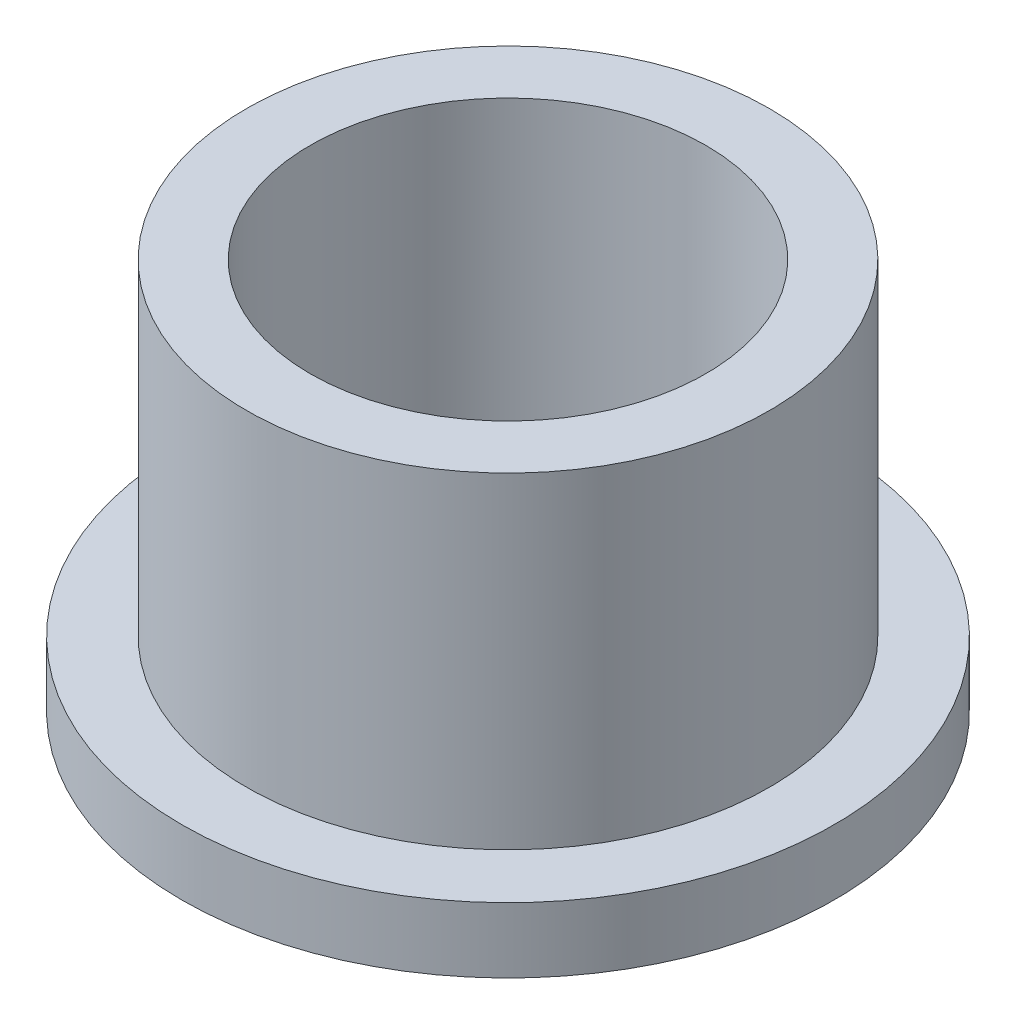
ISO-10303-21;
HEADER;
FILE_DESCRIPTION(('STEP AP214'),'2;1');
FILE_NAME('part.step','',(''),(''),'','','');
FILE_SCHEMA(('AUTOMOTIVE_DESIGN { 1 0 10303 214 1 1 1 1 }'));
ENDSEC;
DATA;
#1=APPLICATION_CONTEXT('core data for automotive mechanical design processes');
#2=APPLICATION_PROTOCOL_DEFINITION('international standard','automotive_design',2000,#1);
#3=PRODUCT_CONTEXT('',#1,'mechanical');
#4=PRODUCT('Part','Part','',(#3));
#5=PRODUCT_RELATED_PRODUCT_CATEGORY('part','',(#4));
#6=PRODUCT_DEFINITION_FORMATION('','',#4);
#7=PRODUCT_DEFINITION_CONTEXT('part definition',#1,'design');
#8=PRODUCT_DEFINITION('design','',#6,#7);
#9=PRODUCT_DEFINITION_SHAPE('','',#8);
#10=(LENGTH_UNIT() NAMED_UNIT(*) SI_UNIT(.MILLI.,.METRE.));
#11=(NAMED_UNIT(*) PLANE_ANGLE_UNIT() SI_UNIT($,.RADIAN.));
#12=(NAMED_UNIT(*) SI_UNIT($,.STERADIAN.) SOLID_ANGLE_UNIT());
#13=UNCERTAINTY_MEASURE_WITH_UNIT(LENGTH_MEASURE(1.E-05),#10,'distance_accuracy_value','');
#14=(GEOMETRIC_REPRESENTATION_CONTEXT(3) GLOBAL_UNCERTAINTY_ASSIGNED_CONTEXT((#13)) GLOBAL_UNIT_ASSIGNED_CONTEXT((#10,
#11,#12)) REPRESENTATION_CONTEXT('',''));
#15=CARTESIAN_POINT('',(0.,0.,0.));
#16=DIRECTION('',(0.,0.,1.));
#17=DIRECTION('',(1.,0.,0.));
#18=AXIS2_PLACEMENT_3D('',#15,#16,#17);
#19=CARTESIAN_POINT('',(0.,9.525,0.));
#20=DIRECTION('',(0.,1.,0.));
#21=DIRECTION('',(0.,0.,1.));
#22=AXIS2_PLACEMENT_3D('',#19,#20,#21);
#23=PLANE('',#22);
#24=CARTESIAN_POINT('',(0.,9.525,0.));
#25=DIRECTION('',(0.,1.,0.));
#26=DIRECTION('',(0.,0.,1.));
#27=AXIS2_PLACEMENT_3D('',#24,#25,#26);
#28=CIRCLE('',#27,6.3627);
#29=CARTESIAN_POINT('',(0.,9.525,-6.3627));
#30=VERTEX_POINT('',#29);
#31=EDGE_CURVE('E10',#30,#30,#28,.T.);
#32=ORIENTED_EDGE('',*,*,#31,.T.);
#33=EDGE_LOOP('',(#32));
#34=FACE_BOUND('',#33,.T.);
#35=CARTESIAN_POINT('',(0.,9.525,0.));
#36=DIRECTION('',(0.,1.,0.));
#37=DIRECTION('',(0.,0.,1.));
#38=AXIS2_PLACEMENT_3D('',#35,#36,#37);
#39=CIRCLE('',#38,4.8133);
#40=CARTESIAN_POINT('',(0.,9.525,-4.8133));
#41=VERTEX_POINT('',#40);
#42=EDGE_CURVE('E41',#41,#41,#39,.T.);
#43=ORIENTED_EDGE('',*,*,#42,.F.);
#44=EDGE_LOOP('',(#43));
#45=FACE_BOUND('',#44,.T.);
#46=ADVANCED_FACE('F34',(#34,#45),#23,.T.);
#47=CARTESIAN_POINT('',(0.,0.,0.));
#48=DIRECTION('',(0.,1.,0.));
#49=DIRECTION('',(0.,0.,1.));
#50=AXIS2_PLACEMENT_3D('',#47,#48,#49);
#51=PLANE('',#50);
#52=CARTESIAN_POINT('',(0.,0.,0.));
#53=DIRECTION('',(0.,1.,0.));
#54=DIRECTION('',(0.,0.,1.));
#55=AXIS2_PLACEMENT_3D('',#52,#53,#54);
#56=CIRCLE('',#55,4.8133);
#57=CARTESIAN_POINT('',(0.,0.,-4.8133));
#58=VERTEX_POINT('',#57);
#59=EDGE_CURVE('E45',#58,#58,#56,.T.);
#60=ORIENTED_EDGE('',*,*,#59,.T.);
#61=EDGE_LOOP('',(#60));
#62=FACE_BOUND('',#61,.T.);
#63=CARTESIAN_POINT('',(0.,0.,0.));
#64=DIRECTION('',(0.,1.,0.));
#65=DIRECTION('',(0.,0.,1.));
#66=AXIS2_PLACEMENT_3D('',#63,#64,#65);
#67=CIRCLE('',#66,7.9375);
#68=CARTESIAN_POINT('',(0.,0.,7.9375));
#69=VERTEX_POINT('',#68);
#70=EDGE_CURVE('E52',#69,#69,#67,.T.);
#71=ORIENTED_EDGE('',*,*,#70,.F.);
#72=EDGE_LOOP('',(#71));
#73=FACE_BOUND('',#72,.T.);
#74=ADVANCED_FACE('F77',(#62,#73),#51,.F.);
#75=CARTESIAN_POINT('',(0.,9.525,0.));
#76=DIRECTION('',(0.,-1.,0.));
#77=DIRECTION('',(0.,0.,-1.));
#78=AXIS2_PLACEMENT_3D('',#75,#76,#77);
#79=CYLINDRICAL_SURFACE('',#78,6.3627);
#80=CARTESIAN_POINT('',(0.,1.5875,0.));
#81=DIRECTION('',(0.,1.,0.));
#82=DIRECTION('',(0.,0.,1.));
#83=AXIS2_PLACEMENT_3D('',#80,#81,#82);
#84=CIRCLE('',#83,6.3627);
#85=CARTESIAN_POINT('',(0.,1.5875,-6.3627));
#86=VERTEX_POINT('',#85);
#87=EDGE_CURVE('E55',#86,#86,#84,.T.);
#88=CARTESIAN_POINT('',(0.,1.5875,-6.3627));
#89=CARTESIAN_POINT('',(0.,1.67018229166667,-6.3627));
#90=CARTESIAN_POINT('',(0.,1.75286458333333,-6.3627));
#91=CARTESIAN_POINT('',(0.,1.91822916666666,-6.3627));
#92=CARTESIAN_POINT('',(0.,2.00091145833333,-6.3627));
#93=CARTESIAN_POINT('',(0.,2.16627604166666,-6.3627));
#94=CARTESIAN_POINT('',(0.,2.24895833333333,-6.3627));
#95=CARTESIAN_POINT('',(0.,2.41432291666667,-6.3627));
#96=CARTESIAN_POINT('',(0.,2.49700520833333,-6.3627));
#97=CARTESIAN_POINT('',(0.,2.66236979166666,-6.3627));
#98=CARTESIAN_POINT('',(0.,2.74505208333333,-6.3627));
#99=CARTESIAN_POINT('',(0.,2.91041666666667,-6.3627));
#100=CARTESIAN_POINT('',(0.,2.99309895833333,-6.3627));
#101=CARTESIAN_POINT('',(0.,3.15846354166667,-6.3627));
#102=CARTESIAN_POINT('',(0.,3.24114583333333,-6.3627));
#103=CARTESIAN_POINT('',(0.,3.40651041666667,-6.3627));
#104=CARTESIAN_POINT('',(0.,3.48919270833333,-6.3627));
#105=CARTESIAN_POINT('',(0.,3.65455729166666,-6.3627));
#106=CARTESIAN_POINT('',(0.,3.73723958333333,-6.3627));
#107=CARTESIAN_POINT('',(0.,3.90260416666667,-6.3627));
#108=CARTESIAN_POINT('',(0.,3.98528645833333,-6.3627));
#109=CARTESIAN_POINT('',(0.,4.15065104166666,-6.3627));
#110=CARTESIAN_POINT('',(0.,4.23333333333333,-6.3627));
#111=CARTESIAN_POINT('',(0.,4.39869791666667,-6.3627));
#112=CARTESIAN_POINT('',(0.,4.48138020833333,-6.3627));
#113=CARTESIAN_POINT('',(0.,4.64674479166667,-6.3627));
#114=CARTESIAN_POINT('',(0.,4.72942708333333,-6.3627));
#115=CARTESIAN_POINT('',(0.,4.89479166666667,-6.3627));
#116=CARTESIAN_POINT('',(0.,4.97747395833333,-6.3627));
#117=CARTESIAN_POINT('',(0.,5.14283854166666,-6.3627));
#118=CARTESIAN_POINT('',(0.,5.22552083333333,-6.3627));
#119=CARTESIAN_POINT('',(0.,5.39088541666667,-6.3627));
#120=CARTESIAN_POINT('',(0.,5.47356770833333,-6.3627));
#121=CARTESIAN_POINT('',(0.,5.63893229166666,-6.3627));
#122=CARTESIAN_POINT('',(0.,5.72161458333333,-6.3627));
#123=CARTESIAN_POINT('',(0.,5.88697916666666,-6.3627));
#124=CARTESIAN_POINT('',(0.,5.96966145833333,-6.3627));
#125=CARTESIAN_POINT('',(0.,6.13502604166666,-6.3627));
#126=CARTESIAN_POINT('',(0.,6.21770833333333,-6.3627));
#127=CARTESIAN_POINT('',(0.,6.38307291666667,-6.3627));
#128=CARTESIAN_POINT('',(0.,6.46575520833333,-6.3627));
#129=CARTESIAN_POINT('',(0.,6.63111979166666,-6.3627));
#130=CARTESIAN_POINT('',(0.,6.71380208333333,-6.3627));
#131=CARTESIAN_POINT('',(0.,6.87916666666666,-6.3627));
#132=CARTESIAN_POINT('',(0.,6.96184895833333,-6.3627));
#133=CARTESIAN_POINT('',(0.,7.12721354166666,-6.3627));
#134=CARTESIAN_POINT('',(0.,7.20989583333333,-6.3627));
#135=CARTESIAN_POINT('',(0.,7.37526041666667,-6.3627));
#136=CARTESIAN_POINT('',(0.,7.45794270833333,-6.3627));
#137=CARTESIAN_POINT('',(0.,7.62330729166666,-6.3627));
#138=CARTESIAN_POINT('',(0.,7.70598958333333,-6.3627));
#139=CARTESIAN_POINT('',(0.,7.87135416666667,-6.3627));
#140=CARTESIAN_POINT('',(0.,7.95403645833333,-6.3627));
#141=CARTESIAN_POINT('',(0.,8.11940104166667,-6.3627));
#142=CARTESIAN_POINT('',(0.,8.20208333333333,-6.3627));
#143=CARTESIAN_POINT('',(0.,8.36744791666667,-6.3627));
#144=CARTESIAN_POINT('',(0.,8.45013020833333,-6.3627));
#145=CARTESIAN_POINT('',(0.,8.61549479166667,-6.3627));
#146=CARTESIAN_POINT('',(0.,8.69817708333333,-6.3627));
#147=CARTESIAN_POINT('',(0.,8.86354166666666,-6.3627));
#148=CARTESIAN_POINT('',(0.,8.94622395833333,-6.3627));
#149=CARTESIAN_POINT('',(0.,9.11158854166667,-6.3627));
#150=CARTESIAN_POINT('',(0.,9.19427083333333,-6.3627));
#151=CARTESIAN_POINT('',(0.,9.35963541666667,-6.3627));
#152=CARTESIAN_POINT('',(0.,9.44231770833333,-6.3627));
#153=CARTESIAN_POINT('',(0.,9.525,-6.3627));
#154=B_SPLINE_CURVE_WITH_KNOTS('',3,(#88,#89,#90,#91,#92,#93,#94,#95,#96,#97,#98,#99,#100,#101,
#102,#103,#104,#105,#106,#107,#108,#109,#110,#111,#112,#113,#114,#115,#116,#117,#118,#119,#120,
#121,#122,#123,#124,#125,#126,#127,#128,#129,#130,#131,#132,#133,#134,#135,#136,#137,#138,#139,
#140,#141,#142,#143,#144,#145,#146,#147,#148,#149,#150,#151,#152,#153),.UNSPECIFIED.,.F.,.F.,(4,
2,2,2,2,2,2,2,2,2,2,2,2,2,2,2,2,2,2,2,2,2,2,2,2,2,2,2,2,2,2,2,4),(0.,0.248046875,
0.496093749999999,0.744140625,0.992187499999999,1.240234375,1.48828125,1.736328125,1.984375,
2.232421875,2.48046875,2.728515625,2.9765625,3.224609375,3.47265625,3.720703125,3.96875,
4.216796875,4.46484375,4.712890625,4.9609375,5.208984375,5.45703125,5.705078125,5.953125,
6.201171875,6.44921875,6.697265625,6.9453125,7.193359375,7.44140625,7.689453125,7.9375),.UNSPECIFIED.);
#155=EDGE_CURVE('BSEAM36',#86,#30,#154,.T.);
#156=ORIENTED_EDGE('',*,*,#87,.T.);
#157=ORIENTED_EDGE('',*,*,#31,.F.);
#158=ORIENTED_EDGE('',*,*,#155,.T.);
#159=ORIENTED_EDGE('',*,*,#155,.F.);
#160=EDGE_LOOP('',(#156,#158,#157,#159));
#161=FACE_BOUND('',#160,.T.);
#162=ADVANCED_FACE('F36',(#161),#79,.T.);
#163=CARTESIAN_POINT('',(0.,9.525,0.));
#164=DIRECTION('',(0.,-1.,0.));
#165=DIRECTION('',(0.,0.,-1.));
#166=AXIS2_PLACEMENT_3D('',#163,#164,#165);
#167=CYLINDRICAL_SURFACE('',#166,4.8133);
#168=CARTESIAN_POINT('',(0.,9.525,-4.8133));
#169=CARTESIAN_POINT('',(0.,9.42578125,-4.8133));
#170=CARTESIAN_POINT('',(0.,9.3265625,-4.8133));
#171=CARTESIAN_POINT('',(0.,9.128125,-4.8133));
#172=CARTESIAN_POINT('',(0.,9.02890625,-4.8133));
#173=CARTESIAN_POINT('',(0.,8.83046875,-4.8133));
#174=CARTESIAN_POINT('',(0.,8.73125,-4.8133));
#175=CARTESIAN_POINT('',(0.,8.5328125,-4.8133));
#176=CARTESIAN_POINT('',(0.,8.43359375,-4.8133));
#177=CARTESIAN_POINT('',(0.,8.23515625,-4.8133));
#178=CARTESIAN_POINT('',(0.,8.1359375,-4.8133));
#179=CARTESIAN_POINT('',(0.,7.9375,-4.8133));
#180=CARTESIAN_POINT('',(0.,7.83828125,-4.8133));
#181=CARTESIAN_POINT('',(0.,7.63984375,-4.8133));
#182=CARTESIAN_POINT('',(0.,7.540625,-4.8133));
#183=CARTESIAN_POINT('',(0.,7.3421875,-4.8133));
#184=CARTESIAN_POINT('',(0.,7.24296875,-4.8133));
#185=CARTESIAN_POINT('',(0.,7.04453125,-4.8133));
#186=CARTESIAN_POINT('',(0.,6.9453125,-4.8133));
#187=CARTESIAN_POINT('',(0.,6.746875,-4.8133));
#188=CARTESIAN_POINT('',(0.,6.64765625,-4.8133));
#189=CARTESIAN_POINT('',(0.,6.44921875,-4.8133));
#190=CARTESIAN_POINT('',(0.,6.35,-4.8133));
#191=CARTESIAN_POINT('',(0.,6.1515625,-4.8133));
#192=CARTESIAN_POINT('',(0.,6.05234375,-4.8133));
#193=CARTESIAN_POINT('',(0.,5.85390625,-4.8133));
#194=CARTESIAN_POINT('',(0.,5.7546875,-4.8133));
#195=CARTESIAN_POINT('',(0.,5.55625,-4.8133));
#196=CARTESIAN_POINT('',(0.,5.45703125,-4.8133));
#197=CARTESIAN_POINT('',(0.,5.25859375,-4.8133));
#198=CARTESIAN_POINT('',(0.,5.159375,-4.8133));
#199=CARTESIAN_POINT('',(0.,4.9609375,-4.8133));
#200=CARTESIAN_POINT('',(0.,4.86171875,-4.8133));
#201=CARTESIAN_POINT('',(0.,4.66328125,-4.8133));
#202=CARTESIAN_POINT('',(0.,4.5640625,-4.8133));
#203=CARTESIAN_POINT('',(0.,4.365625,-4.8133));
#204=CARTESIAN_POINT('',(0.,4.26640625,-4.8133));
#205=CARTESIAN_POINT('',(0.,4.06796875,-4.8133));
#206=CARTESIAN_POINT('',(0.,3.96875,-4.8133));
#207=CARTESIAN_POINT('',(0.,3.7703125,-4.8133));
#208=CARTESIAN_POINT('',(0.,3.67109375,-4.8133));
#209=CARTESIAN_POINT('',(0.,3.47265625,-4.8133));
#210=CARTESIAN_POINT('',(0.,3.3734375,-4.8133));
#211=CARTESIAN_POINT('',(0.,3.175,-4.8133));
#212=CARTESIAN_POINT('',(0.,3.07578125,-4.8133));
#213=CARTESIAN_POINT('',(0.,2.87734375,-4.8133));
#214=CARTESIAN_POINT('',(0.,2.778125,-4.8133));
#215=CARTESIAN_POINT('',(0.,2.5796875,-4.8133));
#216=CARTESIAN_POINT('',(0.,2.48046875,-4.8133));
#217=CARTESIAN_POINT('',(0.,2.28203125,-4.8133));
#218=CARTESIAN_POINT('',(0.,2.1828125,-4.8133));
#219=CARTESIAN_POINT('',(0.,1.984375,-4.8133));
#220=CARTESIAN_POINT('',(0.,1.88515625,-4.8133));
#221=CARTESIAN_POINT('',(0.,1.68671875,-4.8133));
#222=CARTESIAN_POINT('',(0.,1.5875,-4.8133));
#223=CARTESIAN_POINT('',(0.,1.3890625,-4.8133));
#224=CARTESIAN_POINT('',(0.,1.28984375,-4.8133));
#225=CARTESIAN_POINT('',(0.,1.09140625,-4.8133));
#226=CARTESIAN_POINT('',(0.,0.992187500000001,-4.8133));
#227=CARTESIAN_POINT('',(0.,0.793750000000001,-4.8133));
#228=CARTESIAN_POINT('',(0.,0.69453125,-4.8133));
#229=CARTESIAN_POINT('',(0.,0.49609375,-4.8133));
#230=CARTESIAN_POINT('',(0.,0.396875,-4.8133));
#231=CARTESIAN_POINT('',(0.,0.1984375,-4.8133));
#232=CARTESIAN_POINT('',(0.,0.0992187500000001,-4.8133));
#233=CARTESIAN_POINT('',(0.,0.,-4.8133));
#234=B_SPLINE_CURVE_WITH_KNOTS('',3,(#168,#169,#170,#171,#172,#173,#174,#175,#176,#177,#178,
#179,#180,#181,#182,#183,#184,#185,#186,#187,#188,#189,#190,#191,#192,#193,#194,#195,#196,#197,
#198,#199,#200,#201,#202,#203,#204,#205,#206,#207,#208,#209,#210,#211,#212,#213,#214,#215,#216,
#217,#218,#219,#220,#221,#222,#223,#224,#225,#226,#227,#228,#229,#230,#231,#232,#233),
.UNSPECIFIED.,.F.,.F.,(4,2,2,2,2,2,2,2,2,2,2,2,2,2,2,2,2,2,2,2,2,2,2,2,2,2,2,2,2,2,2,2,4),(0.,
0.297656249999998,0.595312499999999,0.892968749999999,1.190625,1.48828125,1.7859375,2.08359375,
2.38125,2.67890625,2.9765625,3.27421875,3.571875,3.86953125,4.1671875,4.46484375,4.7625,
5.06015625,5.3578125,5.65546875,5.953125,6.25078125,6.5484375,6.84609375,7.14375,7.44140625,
7.7390625,8.03671875,8.334375,8.63203125,8.9296875,9.22734375,9.525),.UNSPECIFIED.);
#235=EDGE_CURVE('BSEAM66',#41,#58,#234,.T.);
#236=ORIENTED_EDGE('',*,*,#42,.T.);
#237=ORIENTED_EDGE('',*,*,#59,.F.);
#238=ORIENTED_EDGE('',*,*,#235,.T.);
#239=ORIENTED_EDGE('',*,*,#235,.F.);
#240=EDGE_LOOP('',(#236,#238,#237,#239));
#241=FACE_BOUND('',#240,.T.);
#242=ADVANCED_FACE('F66',(#241),#167,.F.);
#243=CARTESIAN_POINT('',(0.,1.5875,0.));
#244=DIRECTION('',(0.,1.,0.));
#245=DIRECTION('',(0.,0.,1.));
#246=AXIS2_PLACEMENT_3D('',#243,#244,#245);
#247=PLANE('',#246);
#248=CARTESIAN_POINT('',(0.,1.5875,0.));
#249=DIRECTION('',(0.,1.,0.));
#250=DIRECTION('',(0.,0.,1.));
#251=AXIS2_PLACEMENT_3D('',#248,#249,#250);
#252=CIRCLE('',#251,7.9375);
#253=CARTESIAN_POINT('',(0.,1.5875,7.9375));
#254=VERTEX_POINT('',#253);
#255=EDGE_CURVE('E50',#254,#254,#252,.T.);
#256=ORIENTED_EDGE('',*,*,#255,.T.);
#257=EDGE_LOOP('',(#256));
#258=FACE_BOUND('',#257,.T.);
#259=ORIENTED_EDGE('',*,*,#87,.F.);
#260=EDGE_LOOP('',(#259));
#261=FACE_BOUND('',#260,.T.);
#262=ADVANCED_FACE('F63',(#258,#261),#247,.T.);
#263=CARTESIAN_POINT('',(0.,1.5875,0.));
#264=DIRECTION('',(0.,-1.,0.));
#265=DIRECTION('',(0.,0.,-1.));
#266=AXIS2_PLACEMENT_3D('',#263,#264,#265);
#267=CYLINDRICAL_SURFACE('',#266,7.9375);
#268=ORIENTED_EDGE('',*,*,#255,.F.);
#269=EDGE_LOOP('',(#268));
#270=FACE_BOUND('',#269,.T.);
#271=ORIENTED_EDGE('',*,*,#70,.T.);
#272=EDGE_LOOP('',(#271));
#273=FACE_BOUND('',#272,.T.);
#274=ADVANCED_FACE('F65',(#270,#273),#267,.T.);
#275=CLOSED_SHELL('',(#46,#74,#162,#242,#262,#274));
#276=MANIFOLD_SOLID_BREP('B2',#275);
#277=ADVANCED_BREP_SHAPE_REPRESENTATION('',(#18,#276),#14);
#278=SHAPE_DEFINITION_REPRESENTATION(#9,#277);
ENDSEC;
END-ISO-10303-21;
